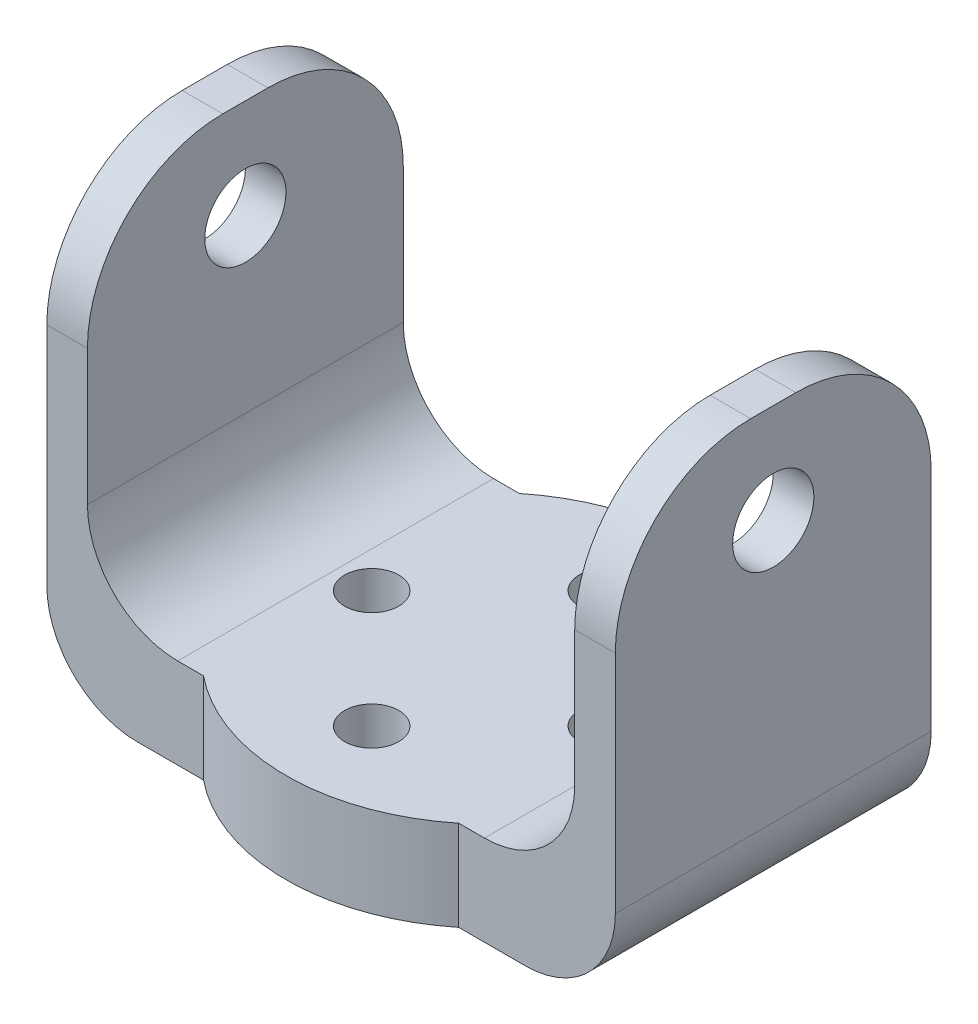
ISO-10303-21;
HEADER;
FILE_DESCRIPTION(('STEP AP214'),'2;1');
FILE_NAME('part.step','',(''),(''),'','','');
FILE_SCHEMA(('AUTOMOTIVE_DESIGN { 1 0 10303 214 1 1 1 1 }'));
ENDSEC;
DATA;
#1=APPLICATION_CONTEXT('core data for automotive mechanical design processes');
#2=APPLICATION_PROTOCOL_DEFINITION('international standard','automotive_design',2000,#1);
#3=PRODUCT_CONTEXT('',#1,'mechanical');
#4=PRODUCT('Part','Part','',(#3));
#5=PRODUCT_RELATED_PRODUCT_CATEGORY('part','',(#4));
#6=PRODUCT_DEFINITION_FORMATION('','',#4);
#7=PRODUCT_DEFINITION_CONTEXT('part definition',#1,'design');
#8=PRODUCT_DEFINITION('design','',#6,#7);
#9=PRODUCT_DEFINITION_SHAPE('','',#8);
#10=(LENGTH_UNIT() NAMED_UNIT(*) SI_UNIT(.MILLI.,.METRE.));
#11=(NAMED_UNIT(*) PLANE_ANGLE_UNIT() SI_UNIT($,.RADIAN.));
#12=(NAMED_UNIT(*) SI_UNIT($,.STERADIAN.) SOLID_ANGLE_UNIT());
#13=UNCERTAINTY_MEASURE_WITH_UNIT(LENGTH_MEASURE(1.E-05),#10,'distance_accuracy_value','');
#14=(GEOMETRIC_REPRESENTATION_CONTEXT(3) GLOBAL_UNCERTAINTY_ASSIGNED_CONTEXT((#13)) GLOBAL_UNIT_ASSIGNED_CONTEXT((#10,
#11,#12)) REPRESENTATION_CONTEXT('',''));
#15=CARTESIAN_POINT('',(0.,0.,0.));
#16=DIRECTION('',(0.,0.,1.));
#17=DIRECTION('',(1.,0.,0.));
#18=AXIS2_PLACEMENT_3D('',#15,#16,#17);
#19=CARTESIAN_POINT('',(0.,0.,-17.5));
#20=DIRECTION('',(0.,0.,1.));
#21=DIRECTION('',(1.,0.,0.));
#22=AXIS2_PLACEMENT_3D('',#19,#20,#21);
#23=PLANE('',#22);
#24=DIRECTION('',(0.,-1.,0.));
#25=VECTOR('',#24,1.);
#26=CARTESIAN_POINT('',(-31.5,50.,-17.5));
#27=LINE('',#26,#25);
#28=CARTESIAN_POINT('',(-31.5,35.,-17.5));
#29=VERTEX_POINT('',#28);
#30=CARTESIAN_POINT('',(-31.5,10.,-17.5));
#31=VERTEX_POINT('',#30);
#32=EDGE_CURVE('E239',#29,#31,#27,.T.);
#33=ORIENTED_EDGE('',*,*,#32,.F.);
#34=DIRECTION('',(-1.,0.,0.));
#35=VECTOR('',#34,1.);
#36=CARTESIAN_POINT('',(-27.,35.,-17.5));
#37=LINE('',#36,#35);
#38=CARTESIAN_POINT('',(-27.,35.,-17.5));
#39=VERTEX_POINT('',#38);
#40=EDGE_CURVE('E60',#29,#39,#37,.F.);
#41=ORIENTED_EDGE('',*,*,#40,.T.);
#42=DIRECTION('',(0.,1.,0.));
#43=VECTOR('',#42,1.);
#44=CARTESIAN_POINT('',(-27.,10.,-17.5));
#45=LINE('',#44,#43);
#46=CARTESIAN_POINT('',(-27.,20.,-17.5));
#47=VERTEX_POINT('',#46);
#48=EDGE_CURVE('E218',#47,#39,#45,.T.);
#49=ORIENTED_EDGE('',*,*,#48,.F.);
#50=CARTESIAN_POINT('',(-17.,20.,-17.5));
#51=DIRECTION('',(0.,0.,1.));
#52=DIRECTION('',(1.,0.,0.));
#53=AXIS2_PLACEMENT_3D('',#50,#51,#52);
#54=CIRCLE('',#53,10.);
#55=CARTESIAN_POINT('',(-17.,10.,-17.5));
#56=VERTEX_POINT('',#55);
#57=EDGE_CURVE('E214',#47,#56,#54,.T.);
#58=ORIENTED_EDGE('',*,*,#57,.T.);
#59=DIRECTION('',(-1.,0.,0.));
#60=VECTOR('',#59,1.);
#61=CARTESIAN_POINT('',(27.,10.,-17.5));
#62=LINE('',#61,#60);
#63=CARTESIAN_POINT('',(-14.142135623731,10.,-17.5));
#64=VERTEX_POINT('',#63);
#65=EDGE_CURVE('E206',#64,#56,#62,.T.);
#66=ORIENTED_EDGE('',*,*,#65,.F.);
#67=DIRECTION('',(0.,-1.,0.));
#68=VECTOR('',#67,1.);
#69=CARTESIAN_POINT('',(-14.142135623731,10.,-17.5));
#70=LINE('',#69,#68);
#71=CARTESIAN_POINT('',(-14.142135623731,0.,-17.5));
#72=VERTEX_POINT('',#71);
#73=EDGE_CURVE('E189',#64,#72,#70,.T.);
#74=ORIENTED_EDGE('',*,*,#73,.T.);
#75=DIRECTION('',(1.,0.,0.));
#76=VECTOR('',#75,1.);
#77=CARTESIAN_POINT('',(-31.5,0.,-17.5));
#78=LINE('',#77,#76);
#79=CARTESIAN_POINT('',(-21.5,0.,-17.5));
#80=VERTEX_POINT('',#79);
#81=EDGE_CURVE('E334',#80,#72,#78,.T.);
#82=ORIENTED_EDGE('',*,*,#81,.F.);
#83=CARTESIAN_POINT('',(-21.5,10.,-17.5));
#84=DIRECTION('',(0.,0.,1.));
#85=DIRECTION('',(1.,0.,0.));
#86=AXIS2_PLACEMENT_3D('',#83,#84,#85);
#87=CIRCLE('',#86,10.);
#88=EDGE_CURVE('E271',#80,#31,#87,.F.);
#89=ORIENTED_EDGE('',*,*,#88,.T.);
#90=EDGE_LOOP('',(#33,#41,#49,#58,#66,#74,#82,#89));
#91=FACE_BOUND('',#90,.T.);
#92=ADVANCED_FACE('F37',(#91),#23,.F.);
#93=CARTESIAN_POINT('',(0.,0.,17.5));
#94=DIRECTION('',(0.,0.,1.));
#95=DIRECTION('',(1.,0.,0.));
#96=AXIS2_PLACEMENT_3D('',#93,#94,#95);
#97=PLANE('',#96);
#98=DIRECTION('',(0.,1.,0.));
#99=VECTOR('',#98,1.);
#100=CARTESIAN_POINT('',(-27.,10.,17.5));
#101=LINE('',#100,#99);
#102=CARTESIAN_POINT('',(-27.,20.,17.5));
#103=VERTEX_POINT('',#102);
#104=CARTESIAN_POINT('',(-27.,35.,17.5));
#105=VERTEX_POINT('',#104);
#106=EDGE_CURVE('E237',#103,#105,#101,.T.);
#107=ORIENTED_EDGE('',*,*,#106,.T.);
#108=DIRECTION('',(-1.,0.,0.));
#109=VECTOR('',#108,1.);
#110=CARTESIAN_POINT('',(0.,35.,17.5));
#111=LINE('',#110,#109);
#112=CARTESIAN_POINT('',(-31.5,35.,17.5));
#113=VERTEX_POINT('',#112);
#114=EDGE_CURVE('E11',#105,#113,#111,.T.);
#115=ORIENTED_EDGE('',*,*,#114,.T.);
#116=DIRECTION('',(0.,-1.,0.));
#117=VECTOR('',#116,1.);
#118=CARTESIAN_POINT('',(-31.5,50.,17.5));
#119=LINE('',#118,#117);
#120=CARTESIAN_POINT('',(-31.5,10.,17.5));
#121=VERTEX_POINT('',#120);
#122=EDGE_CURVE('E199',#113,#121,#119,.T.);
#123=ORIENTED_EDGE('',*,*,#122,.T.);
#124=CARTESIAN_POINT('',(-21.5,10.,17.5));
#125=DIRECTION('',(0.,0.,1.));
#126=DIRECTION('',(1.,0.,0.));
#127=AXIS2_PLACEMENT_3D('',#124,#125,#126);
#128=CIRCLE('',#127,10.);
#129=CARTESIAN_POINT('',(-21.5,0.,17.5));
#130=VERTEX_POINT('',#129);
#131=EDGE_CURVE('E265',#121,#130,#128,.T.);
#132=ORIENTED_EDGE('',*,*,#131,.T.);
#133=DIRECTION('',(1.,0.,0.));
#134=VECTOR('',#133,1.);
#135=CARTESIAN_POINT('',(-31.5,0.,17.5));
#136=LINE('',#135,#134);
#137=CARTESIAN_POINT('',(-14.142135623731,0.,17.5));
#138=VERTEX_POINT('',#137);
#139=EDGE_CURVE('E227',#130,#138,#136,.T.);
#140=ORIENTED_EDGE('',*,*,#139,.T.);
#141=DIRECTION('',(0.,-1.,0.));
#142=VECTOR('',#141,1.);
#143=CARTESIAN_POINT('',(-14.142135623731,10.,17.5));
#144=LINE('',#143,#142);
#145=CARTESIAN_POINT('',(-14.142135623731,10.,17.5));
#146=VERTEX_POINT('',#145);
#147=EDGE_CURVE('E379',#146,#138,#144,.T.);
#148=ORIENTED_EDGE('',*,*,#147,.F.);
#149=DIRECTION('',(-1.,0.,0.));
#150=VECTOR('',#149,1.);
#151=CARTESIAN_POINT('',(27.,10.,17.5));
#152=LINE('',#151,#150);
#153=CARTESIAN_POINT('',(-17.,10.,17.5));
#154=VERTEX_POINT('',#153);
#155=EDGE_CURVE('E234',#146,#154,#152,.T.);
#156=ORIENTED_EDGE('',*,*,#155,.T.);
#157=CARTESIAN_POINT('',(-17.,20.,17.5));
#158=DIRECTION('',(0.,0.,1.));
#159=DIRECTION('',(1.,0.,0.));
#160=AXIS2_PLACEMENT_3D('',#157,#158,#159);
#161=CIRCLE('',#160,10.);
#162=EDGE_CURVE('E287',#154,#103,#161,.F.);
#163=ORIENTED_EDGE('',*,*,#162,.T.);
#164=EDGE_LOOP('',(#107,#115,#123,#132,#140,#148,#156,#163));
#165=FACE_BOUND('',#164,.T.);
#166=ADVANCED_FACE('F419',(#165),#97,.T.);
#167=CARTESIAN_POINT('',(-31.5,50.,-17.5));
#168=DIRECTION('',(-1.,0.,0.));
#169=DIRECTION('',(0.,0.,1.));
#170=AXIS2_PLACEMENT_3D('',#167,#168,#169);
#171=PLANE('',#170);
#172=CARTESIAN_POINT('',(-31.5,39.,0.));
#173=DIRECTION('',(1.,0.,0.));
#174=DIRECTION('',(0.,1.,0.));
#175=AXIS2_PLACEMENT_3D('',#172,#173,#174);
#176=CIRCLE('',#175,4.5);
#177=CARTESIAN_POINT('',(-31.5,43.5,0.));
#178=VERTEX_POINT('',#177);
#179=EDGE_CURVE('E514',#178,#178,#176,.T.);
#180=ORIENTED_EDGE('',*,*,#179,.T.);
#181=EDGE_LOOP('',(#180));
#182=FACE_BOUND('',#181,.T.);
#183=DIRECTION('',(0.,0.,1.));
#184=VECTOR('',#183,1.);
#185=CARTESIAN_POINT('',(-31.5,50.,-17.5));
#186=LINE('',#185,#184);
#187=CARTESIAN_POINT('',(-31.5,50.,-2.5));
#188=VERTEX_POINT('',#187);
#189=CARTESIAN_POINT('',(-31.5,50.,2.5));
#190=VERTEX_POINT('',#189);
#191=EDGE_CURVE('E240',#188,#190,#186,.T.);
#192=ORIENTED_EDGE('',*,*,#191,.F.);
#193=CARTESIAN_POINT('',(-31.5,35.,-2.5));
#194=DIRECTION('',(-1.,0.,0.));
#195=DIRECTION('',(0.,0.,1.));
#196=AXIS2_PLACEMENT_3D('',#193,#194,#195);
#197=CIRCLE('',#196,15.);
#198=EDGE_CURVE('E315',#188,#29,#197,.T.);
#199=ORIENTED_EDGE('',*,*,#198,.T.);
#200=ORIENTED_EDGE('',*,*,#32,.T.);
#201=DIRECTION('',(0.,0.,1.));
#202=VECTOR('',#201,1.);
#203=CARTESIAN_POINT('',(-31.5,10.,-17.5));
#204=LINE('',#203,#202);
#205=EDGE_CURVE('E277',#31,#121,#204,.T.);
#206=ORIENTED_EDGE('',*,*,#205,.T.);
#207=ORIENTED_EDGE('',*,*,#122,.F.);
#208=CARTESIAN_POINT('',(-31.5,35.,2.5));
#209=DIRECTION('',(-1.,0.,0.));
#210=DIRECTION('',(0.,0.,1.));
#211=AXIS2_PLACEMENT_3D('',#208,#209,#210);
#212=CIRCLE('',#211,15.);
#213=EDGE_CURVE('E313',#113,#190,#212,.T.);
#214=ORIENTED_EDGE('',*,*,#213,.T.);
#215=EDGE_LOOP('',(#192,#199,#200,#206,#207,#214));
#216=FACE_BOUND('',#215,.T.);
#217=ADVANCED_FACE('F329',(#182,#216),#171,.T.);
#218=CARTESIAN_POINT('',(-27.,50.,-17.5));
#219=DIRECTION('',(0.,1.,0.));
#220=DIRECTION('',(0.,0.,1.));
#221=AXIS2_PLACEMENT_3D('',#218,#219,#220);
#222=PLANE('',#221);
#223=DIRECTION('',(0.,0.,1.));
#224=VECTOR('',#223,1.);
#225=CARTESIAN_POINT('',(-27.,50.,-17.5));
#226=LINE('',#225,#224);
#227=CARTESIAN_POINT('',(-27.,50.,-2.5));
#228=VERTEX_POINT('',#227);
#229=CARTESIAN_POINT('',(-27.,50.,2.5));
#230=VERTEX_POINT('',#229);
#231=EDGE_CURVE('E244',#228,#230,#226,.T.);
#232=ORIENTED_EDGE('',*,*,#231,.F.);
#233=DIRECTION('',(-1.,0.,0.));
#234=VECTOR('',#233,1.);
#235=CARTESIAN_POINT('',(-31.5,50.,-2.5));
#236=LINE('',#235,#234);
#237=EDGE_CURVE('E310',#228,#188,#236,.T.);
#238=ORIENTED_EDGE('',*,*,#237,.T.);
#239=ORIENTED_EDGE('',*,*,#191,.T.);
#240=DIRECTION('',(-1.,0.,0.));
#241=VECTOR('',#240,1.);
#242=CARTESIAN_POINT('',(-27.,50.,2.5));
#243=LINE('',#242,#241);
#244=EDGE_CURVE('E308',#190,#230,#243,.F.);
#245=ORIENTED_EDGE('',*,*,#244,.T.);
#246=EDGE_LOOP('',(#232,#238,#239,#245));
#247=FACE_BOUND('',#246,.T.);
#248=ADVANCED_FACE('F324',(#247),#222,.T.);
#249=CARTESIAN_POINT('',(-27.,10.,-17.5));
#250=DIRECTION('',(1.,0.,0.));
#251=DIRECTION('',(0.,1.,0.));
#252=AXIS2_PLACEMENT_3D('',#249,#250,#251);
#253=PLANE('',#252);
#254=CARTESIAN_POINT('',(-27.,39.,0.));
#255=DIRECTION('',(1.,0.,0.));
#256=DIRECTION('',(0.,1.,0.));
#257=AXIS2_PLACEMENT_3D('',#254,#255,#256);
#258=CIRCLE('',#257,4.5);
#259=CARTESIAN_POINT('',(-27.,43.5,0.));
#260=VERTEX_POINT('',#259);
#261=EDGE_CURVE('E489',#260,#260,#258,.T.);
#262=ORIENTED_EDGE('',*,*,#261,.F.);
#263=EDGE_LOOP('',(#262));
#264=FACE_BOUND('',#263,.T.);
#265=ORIENTED_EDGE('',*,*,#48,.T.);
#266=CARTESIAN_POINT('',(-27.,35.,-2.5));
#267=DIRECTION('',(1.,0.,0.));
#268=DIRECTION('',(0.,1.,0.));
#269=AXIS2_PLACEMENT_3D('',#266,#267,#268);
#270=CIRCLE('',#269,15.);
#271=EDGE_CURVE('E45',#39,#228,#270,.T.);
#272=ORIENTED_EDGE('',*,*,#271,.T.);
#273=ORIENTED_EDGE('',*,*,#231,.T.);
#274=CARTESIAN_POINT('',(-27.,35.,2.5));
#275=DIRECTION('',(1.,0.,0.));
#276=DIRECTION('',(0.,1.,0.));
#277=AXIS2_PLACEMENT_3D('',#274,#275,#276);
#278=CIRCLE('',#277,15.);
#279=EDGE_CURVE('E52',#230,#105,#278,.T.);
#280=ORIENTED_EDGE('',*,*,#279,.T.);
#281=ORIENTED_EDGE('',*,*,#106,.F.);
#282=DIRECTION('',(0.,0.,1.));
#283=VECTOR('',#282,1.);
#284=CARTESIAN_POINT('',(-27.,20.,-17.5));
#285=LINE('',#284,#283);
#286=EDGE_CURVE('E280',#103,#47,#285,.F.);
#287=ORIENTED_EDGE('',*,*,#286,.T.);
#288=EDGE_LOOP('',(#265,#272,#273,#280,#281,#287));
#289=FACE_BOUND('',#288,.T.);
#290=ADVANCED_FACE('F320',(#264,#289),#253,.T.);
#291=CARTESIAN_POINT('',(27.,10.,-17.5));
#292=DIRECTION('',(0.,1.,0.));
#293=DIRECTION('',(0.,0.,1.));
#294=AXIS2_PLACEMENT_3D('',#291,#292,#293);
#295=PLANE('',#294);
#296=CARTESIAN_POINT('',(0.,10.,13.));
#297=DIRECTION('',(0.,-1.,0.));
#298=DIRECTION('',(1.,0.,0.));
#299=AXIS2_PLACEMENT_3D('',#296,#297,#298);
#300=CIRCLE('',#299,3.);
#301=CARTESIAN_POINT('',(3.,10.,13.));
#302=VERTEX_POINT('',#301);
#303=EDGE_CURVE('E479',#302,#302,#300,.T.);
#304=ORIENTED_EDGE('',*,*,#303,.T.);
#305=EDGE_LOOP('',(#304));
#306=FACE_BOUND('',#305,.T.);
#307=CARTESIAN_POINT('',(13.,10.,0.));
#308=DIRECTION('',(0.,-1.,0.));
#309=DIRECTION('',(1.,0.,0.));
#310=AXIS2_PLACEMENT_3D('',#307,#308,#309);
#311=CIRCLE('',#310,3.00000000000007);
#312=CARTESIAN_POINT('',(16.0000000000001,10.,0.));
#313=VERTEX_POINT('',#312);
#314=EDGE_CURVE('E494',#313,#313,#311,.T.);
#315=ORIENTED_EDGE('',*,*,#314,.T.);
#316=EDGE_LOOP('',(#315));
#317=FACE_BOUND('',#316,.T.);
#318=CARTESIAN_POINT('',(0.,10.,-13.));
#319=DIRECTION('',(0.,-1.,0.));
#320=DIRECTION('',(1.,0.,0.));
#321=AXIS2_PLACEMENT_3D('',#318,#319,#320);
#322=CIRCLE('',#321,3.);
#323=CARTESIAN_POINT('',(3.,10.,-13.));
#324=VERTEX_POINT('',#323);
#325=EDGE_CURVE('E500',#324,#324,#322,.T.);
#326=ORIENTED_EDGE('',*,*,#325,.T.);
#327=EDGE_LOOP('',(#326));
#328=FACE_BOUND('',#327,.T.);
#329=CARTESIAN_POINT('',(-13.,10.,0.));
#330=DIRECTION('',(0.,-1.,0.));
#331=DIRECTION('',(1.,0.,0.));
#332=AXIS2_PLACEMENT_3D('',#329,#330,#331);
#333=CIRCLE('',#332,2.99999999999999);
#334=CARTESIAN_POINT('',(-10.,10.,0.));
#335=VERTEX_POINT('',#334);
#336=EDGE_CURVE('E477',#335,#335,#333,.T.);
#337=ORIENTED_EDGE('',*,*,#336,.T.);
#338=EDGE_LOOP('',(#337));
#339=FACE_BOUND('',#338,.T.);
#340=ORIENTED_EDGE('',*,*,#155,.F.);
#341=CARTESIAN_POINT('',(0.,10.,0.));
#342=DIRECTION('',(0.,-1.,0.));
#343=DIRECTION('',(1.,0.,0.));
#344=AXIS2_PLACEMENT_3D('',#341,#342,#343);
#345=CIRCLE('',#344,22.5);
#346=CARTESIAN_POINT('',(14.142135623731,10.,17.5));
#347=VERTEX_POINT('',#346);
#348=EDGE_CURVE('E210',#347,#146,#345,.T.);
#349=ORIENTED_EDGE('',*,*,#348,.F.);
#350=CARTESIAN_POINT('',(17.,10.,17.5));
#351=VERTEX_POINT('',#350);
#352=EDGE_CURVE('E235',#351,#347,#152,.T.);
#353=ORIENTED_EDGE('',*,*,#352,.F.);
#354=DIRECTION('',(0.,0.,1.));
#355=VECTOR('',#354,1.);
#356=CARTESIAN_POINT('',(17.,10.,-17.5));
#357=LINE('',#356,#355);
#358=CARTESIAN_POINT('',(17.,10.,-17.5));
#359=VERTEX_POINT('',#358);
#360=EDGE_CURVE('E255',#351,#359,#357,.F.);
#361=ORIENTED_EDGE('',*,*,#360,.T.);
#362=CARTESIAN_POINT('',(14.142135623731,10.,-17.5));
#363=VERTEX_POINT('',#362);
#364=EDGE_CURVE('E209',#359,#363,#62,.T.);
#365=ORIENTED_EDGE('',*,*,#364,.T.);
#366=EDGE_CURVE('E193',#64,#363,#345,.T.);
#367=ORIENTED_EDGE('',*,*,#366,.F.);
#368=ORIENTED_EDGE('',*,*,#65,.T.);
#369=DIRECTION('',(0.,0.,1.));
#370=VECTOR('',#369,1.);
#371=CARTESIAN_POINT('',(-17.,10.,17.5));
#372=LINE('',#371,#370);
#373=EDGE_CURVE('E253',#56,#154,#372,.T.);
#374=ORIENTED_EDGE('',*,*,#373,.T.);
#375=EDGE_LOOP('',(#340,#349,#353,#361,#365,#367,#368,#374));
#376=FACE_BOUND('',#375,.T.);
#377=ADVANCED_FACE('F205',(#306,#317,#328,#339,#376),#295,.T.);
#378=CARTESIAN_POINT('',(27.,50.,-17.5));
#379=DIRECTION('',(-1.,0.,0.));
#380=DIRECTION('',(0.,-1.,0.));
#381=AXIS2_PLACEMENT_3D('',#378,#379,#380);
#382=PLANE('',#381);
#383=CARTESIAN_POINT('',(27.,39.,0.));
#384=DIRECTION('',(-1.,0.,0.));
#385=DIRECTION('',(0.,-1.,0.));
#386=AXIS2_PLACEMENT_3D('',#383,#384,#385);
#387=CIRCLE('',#386,4.5);
#388=CARTESIAN_POINT('',(27.,34.5,0.));
#389=VERTEX_POINT('',#388);
#390=EDGE_CURVE('E510',#389,#389,#387,.T.);
#391=ORIENTED_EDGE('',*,*,#390,.F.);
#392=EDGE_LOOP('',(#391));
#393=FACE_BOUND('',#392,.T.);
#394=DIRECTION('',(0.,-1.,0.));
#395=VECTOR('',#394,1.);
#396=CARTESIAN_POINT('',(27.,50.,17.5));
#397=LINE('',#396,#395);
#398=CARTESIAN_POINT('',(27.,35.,17.5));
#399=VERTEX_POINT('',#398);
#400=CARTESIAN_POINT('',(27.,20.,17.5));
#401=VERTEX_POINT('',#400);
#402=EDGE_CURVE('E232',#399,#401,#397,.T.);
#403=ORIENTED_EDGE('',*,*,#402,.F.);
#404=CARTESIAN_POINT('',(27.,35.,2.5));
#405=DIRECTION('',(-1.,0.,0.));
#406=DIRECTION('',(0.,-1.,0.));
#407=AXIS2_PLACEMENT_3D('',#404,#405,#406);
#408=CIRCLE('',#407,15.);
#409=CARTESIAN_POINT('',(27.,50.,2.5));
#410=VERTEX_POINT('',#409);
#411=EDGE_CURVE('E295',#399,#410,#408,.T.);
#412=ORIENTED_EDGE('',*,*,#411,.T.);
#413=DIRECTION('',(0.,0.,1.));
#414=VECTOR('',#413,1.);
#415=CARTESIAN_POINT('',(27.,50.,-17.5));
#416=LINE('',#415,#414);
#417=CARTESIAN_POINT('',(27.,50.,-2.5));
#418=VERTEX_POINT('',#417);
#419=EDGE_CURVE('E246',#418,#410,#416,.T.);
#420=ORIENTED_EDGE('',*,*,#419,.F.);
#421=CARTESIAN_POINT('',(27.,35.,-2.5));
#422=DIRECTION('',(-1.,0.,0.));
#423=DIRECTION('',(0.,-1.,0.));
#424=AXIS2_PLACEMENT_3D('',#421,#422,#423);
#425=CIRCLE('',#424,15.);
#426=CARTESIAN_POINT('',(27.,35.,-17.5));
#427=VERTEX_POINT('',#426);
#428=EDGE_CURVE('E293',#418,#427,#425,.T.);
#429=ORIENTED_EDGE('',*,*,#428,.T.);
#430=DIRECTION('',(0.,-1.,0.));
#431=VECTOR('',#430,1.);
#432=CARTESIAN_POINT('',(27.,50.,-17.5));
#433=LINE('',#432,#431);
#434=CARTESIAN_POINT('',(27.,20.,-17.5));
#435=VERTEX_POINT('',#434);
#436=EDGE_CURVE('E216',#427,#435,#433,.T.);
#437=ORIENTED_EDGE('',*,*,#436,.T.);
#438=DIRECTION('',(0.,0.,1.));
#439=VECTOR('',#438,1.);
#440=CARTESIAN_POINT('',(27.,20.,17.5));
#441=LINE('',#440,#439);
#442=EDGE_CURVE('E243',#435,#401,#441,.T.);
#443=ORIENTED_EDGE('',*,*,#442,.T.);
#444=EDGE_LOOP('',(#403,#412,#420,#429,#437,#443));
#445=FACE_BOUND('',#444,.T.);
#446=ADVANCED_FACE('F357',(#393,#445),#382,.T.);
#447=CARTESIAN_POINT('',(31.5,50.,-17.5));
#448=DIRECTION('',(0.,1.,0.));
#449=DIRECTION('',(0.,0.,1.));
#450=AXIS2_PLACEMENT_3D('',#447,#448,#449);
#451=PLANE('',#450);
#452=ORIENTED_EDGE('',*,*,#419,.T.);
#453=DIRECTION('',(-1.,0.,0.));
#454=VECTOR('',#453,1.);
#455=CARTESIAN_POINT('',(31.5,50.,2.5));
#456=LINE('',#455,#454);
#457=CARTESIAN_POINT('',(31.5,50.,2.5));
#458=VERTEX_POINT('',#457);
#459=EDGE_CURVE('E300',#410,#458,#456,.F.);
#460=ORIENTED_EDGE('',*,*,#459,.T.);
#461=DIRECTION('',(0.,0.,1.));
#462=VECTOR('',#461,1.);
#463=CARTESIAN_POINT('',(31.5,50.,-17.5));
#464=LINE('',#463,#462);
#465=CARTESIAN_POINT('',(31.5,50.,-2.5));
#466=VERTEX_POINT('',#465);
#467=EDGE_CURVE('E224',#466,#458,#464,.T.);
#468=ORIENTED_EDGE('',*,*,#467,.F.);
#469=DIRECTION('',(-1.,0.,0.));
#470=VECTOR('',#469,1.);
#471=CARTESIAN_POINT('',(27.,50.,-2.5));
#472=LINE('',#471,#470);
#473=EDGE_CURVE('E297',#466,#418,#472,.T.);
#474=ORIENTED_EDGE('',*,*,#473,.T.);
#475=EDGE_LOOP('',(#452,#460,#468,#474));
#476=FACE_BOUND('',#475,.T.);
#477=ADVANCED_FACE('F353',(#476),#451,.T.);
#478=CARTESIAN_POINT('',(31.5,0.,-17.5));
#479=DIRECTION('',(1.,0.,0.));
#480=DIRECTION('',(0.,0.,-1.));
#481=AXIS2_PLACEMENT_3D('',#478,#479,#480);
#482=PLANE('',#481);
#483=CARTESIAN_POINT('',(31.5,39.,0.));
#484=DIRECTION('',(1.,0.,0.));
#485=DIRECTION('',(0.,1.,0.));
#486=AXIS2_PLACEMENT_3D('',#483,#484,#485);
#487=CIRCLE('',#486,4.5);
#488=CARTESIAN_POINT('',(31.5,43.5,0.));
#489=VERTEX_POINT('',#488);
#490=EDGE_CURVE('E518',#489,#489,#487,.T.);
#491=ORIENTED_EDGE('',*,*,#490,.F.);
#492=EDGE_LOOP('',(#491));
#493=FACE_BOUND('',#492,.T.);
#494=ORIENTED_EDGE('',*,*,#467,.T.);
#495=CARTESIAN_POINT('',(31.5,35.,2.5));
#496=DIRECTION('',(1.,0.,0.));
#497=DIRECTION('',(0.,0.,-1.));
#498=AXIS2_PLACEMENT_3D('',#495,#496,#497);
#499=CIRCLE('',#498,15.);
#500=CARTESIAN_POINT('',(31.5,35.,17.5));
#501=VERTEX_POINT('',#500);
#502=EDGE_CURVE('E304',#458,#501,#499,.T.);
#503=ORIENTED_EDGE('',*,*,#502,.T.);
#504=DIRECTION('',(0.,1.,0.));
#505=VECTOR('',#504,1.);
#506=CARTESIAN_POINT('',(31.5,0.,17.5));
#507=LINE('',#506,#505);
#508=CARTESIAN_POINT('',(31.5,10.,17.5));
#509=VERTEX_POINT('',#508);
#510=EDGE_CURVE('E229',#509,#501,#507,.T.);
#511=ORIENTED_EDGE('',*,*,#510,.F.);
#512=DIRECTION('',(0.,0.,1.));
#513=VECTOR('',#512,1.);
#514=CARTESIAN_POINT('',(31.5,10.,-17.5));
#515=LINE('',#514,#513);
#516=CARTESIAN_POINT('',(31.5,10.,-17.5));
#517=VERTEX_POINT('',#516);
#518=EDGE_CURVE('E269',#509,#517,#515,.F.);
#519=ORIENTED_EDGE('',*,*,#518,.T.);
#520=DIRECTION('',(0.,1.,0.));
#521=VECTOR('',#520,1.);
#522=CARTESIAN_POINT('',(31.5,0.,-17.5));
#523=LINE('',#522,#521);
#524=CARTESIAN_POINT('',(31.5,35.,-17.5));
#525=VERTEX_POINT('',#524);
#526=EDGE_CURVE('E219',#517,#525,#523,.T.);
#527=ORIENTED_EDGE('',*,*,#526,.T.);
#528=CARTESIAN_POINT('',(31.5,35.,-2.5));
#529=DIRECTION('',(1.,0.,0.));
#530=DIRECTION('',(0.,0.,-1.));
#531=AXIS2_PLACEMENT_3D('',#528,#529,#530);
#532=CIRCLE('',#531,15.);
#533=EDGE_CURVE('E302',#525,#466,#532,.T.);
#534=ORIENTED_EDGE('',*,*,#533,.T.);
#535=EDGE_LOOP('',(#494,#503,#511,#519,#527,#534));
#536=FACE_BOUND('',#535,.T.);
#537=ADVANCED_FACE('F341',(#493,#536),#482,.T.);
#538=CARTESIAN_POINT('',(-31.5,0.,-17.5));
#539=DIRECTION('',(0.,-1.,0.));
#540=DIRECTION('',(1.,0.,0.));
#541=AXIS2_PLACEMENT_3D('',#538,#539,#540);
#542=PLANE('',#541);
#543=CARTESIAN_POINT('',(0.,0.,13.));
#544=DIRECTION('',(0.,-1.,0.));
#545=DIRECTION('',(1.,0.,0.));
#546=AXIS2_PLACEMENT_3D('',#543,#544,#545);
#547=CIRCLE('',#546,3.);
#548=CARTESIAN_POINT('',(3.,0.,13.));
#549=VERTEX_POINT('',#548);
#550=EDGE_CURVE('E482',#549,#549,#547,.T.);
#551=ORIENTED_EDGE('',*,*,#550,.F.);
#552=EDGE_LOOP('',(#551));
#553=FACE_BOUND('',#552,.T.);
#554=CARTESIAN_POINT('',(13.,0.,0.));
#555=DIRECTION('',(0.,-1.,0.));
#556=DIRECTION('',(1.,0.,0.));
#557=AXIS2_PLACEMENT_3D('',#554,#555,#556);
#558=CIRCLE('',#557,3.00000000000007);
#559=CARTESIAN_POINT('',(16.0000000000001,0.,0.));
#560=VERTEX_POINT('',#559);
#561=EDGE_CURVE('E486',#560,#560,#558,.T.);
#562=ORIENTED_EDGE('',*,*,#561,.F.);
#563=EDGE_LOOP('',(#562));
#564=FACE_BOUND('',#563,.T.);
#565=CARTESIAN_POINT('',(0.,0.,-13.));
#566=DIRECTION('',(0.,-1.,0.));
#567=DIRECTION('',(1.,0.,0.));
#568=AXIS2_PLACEMENT_3D('',#565,#566,#567);
#569=CIRCLE('',#568,3.);
#570=CARTESIAN_POINT('',(3.,0.,-13.));
#571=VERTEX_POINT('',#570);
#572=EDGE_CURVE('E497',#571,#571,#569,.T.);
#573=ORIENTED_EDGE('',*,*,#572,.F.);
#574=EDGE_LOOP('',(#573));
#575=FACE_BOUND('',#574,.T.);
#576=CARTESIAN_POINT('',(-13.,0.,0.));
#577=DIRECTION('',(0.,-1.,0.));
#578=DIRECTION('',(1.,0.,0.));
#579=AXIS2_PLACEMENT_3D('',#576,#577,#578);
#580=CIRCLE('',#579,2.99999999999999);
#581=CARTESIAN_POINT('',(-10.,0.,0.));
#582=VERTEX_POINT('',#581);
#583=EDGE_CURVE('E502',#582,#582,#580,.T.);
#584=ORIENTED_EDGE('',*,*,#583,.F.);
#585=EDGE_LOOP('',(#584));
#586=FACE_BOUND('',#585,.T.);
#587=DIRECTION('',(0.,0.,1.));
#588=VECTOR('',#587,1.);
#589=CARTESIAN_POINT('',(21.5,0.,-17.5));
#590=LINE('',#589,#588);
#591=CARTESIAN_POINT('',(21.5,0.,-17.5));
#592=VERTEX_POINT('',#591);
#593=CARTESIAN_POINT('',(21.5,0.,-6.63324958071082));
#594=VERTEX_POINT('',#593);
#595=EDGE_CURVE('E262',#592,#594,#590,.T.);
#596=ORIENTED_EDGE('',*,*,#595,.T.);
#597=CARTESIAN_POINT('',(0.,0.,0.));
#598=DIRECTION('',(0.,-1.,0.));
#599=DIRECTION('',(1.,0.,0.));
#600=AXIS2_PLACEMENT_3D('',#597,#598,#599);
#601=CIRCLE('',#600,22.5);
#602=CARTESIAN_POINT('',(21.5,0.,6.63324958071082));
#603=VERTEX_POINT('',#602);
#604=EDGE_CURVE('E377',#594,#603,#601,.T.);
#605=ORIENTED_EDGE('',*,*,#604,.T.);
#606=CARTESIAN_POINT('',(21.5,0.,17.5));
#607=VERTEX_POINT('',#606);
#608=EDGE_CURVE('E261',#603,#607,#590,.T.);
#609=ORIENTED_EDGE('',*,*,#608,.T.);
#610=CARTESIAN_POINT('',(14.142135623731,0.,17.5));
#611=VERTEX_POINT('',#610);
#612=EDGE_CURVE('E226',#611,#607,#136,.T.);
#613=ORIENTED_EDGE('',*,*,#612,.F.);
#614=EDGE_CURVE('E211',#611,#138,#601,.T.);
#615=ORIENTED_EDGE('',*,*,#614,.T.);
#616=ORIENTED_EDGE('',*,*,#139,.F.);
#617=DIRECTION('',(0.,0.,1.));
#618=VECTOR('',#617,1.);
#619=CARTESIAN_POINT('',(-21.5,0.,-17.5));
#620=LINE('',#619,#618);
#621=CARTESIAN_POINT('',(-21.5,0.,6.63324958071084));
#622=VERTEX_POINT('',#621);
#623=EDGE_CURVE('E258',#130,#622,#620,.F.);
#624=ORIENTED_EDGE('',*,*,#623,.T.);
#625=CARTESIAN_POINT('',(-21.5,0.,-6.63324958071084));
#626=VERTEX_POINT('',#625);
#627=EDGE_CURVE('E376',#622,#626,#601,.T.);
#628=ORIENTED_EDGE('',*,*,#627,.T.);
#629=EDGE_CURVE('E257',#626,#80,#620,.F.);
#630=ORIENTED_EDGE('',*,*,#629,.T.);
#631=ORIENTED_EDGE('',*,*,#81,.T.);
#632=CARTESIAN_POINT('',(14.1421356237309,0.,-17.5));
#633=VERTEX_POINT('',#632);
#634=EDGE_CURVE('E195',#72,#633,#601,.T.);
#635=ORIENTED_EDGE('',*,*,#634,.T.);
#636=EDGE_CURVE('E332',#633,#592,#78,.T.);
#637=ORIENTED_EDGE('',*,*,#636,.T.);
#638=EDGE_LOOP('',(#596,#605,#609,#613,#615,#616,#624,#628,#630,#631,#635,#637));
#639=FACE_BOUND('',#638,.T.);
#640=ADVANCED_FACE('F375',(#553,#564,#575,#586,#639),#542,.T.);
#641=ORIENTED_EDGE('',*,*,#436,.F.);
#642=DIRECTION('',(-1.,0.,0.));
#643=VECTOR('',#642,1.);
#644=CARTESIAN_POINT('',(31.5,35.,-17.5));
#645=LINE('',#644,#643);
#646=EDGE_CURVE('E306',#427,#525,#645,.F.);
#647=ORIENTED_EDGE('',*,*,#646,.T.);
#648=ORIENTED_EDGE('',*,*,#526,.F.);
#649=CARTESIAN_POINT('',(21.5,10.,-17.5));
#650=DIRECTION('',(0.,0.,1.));
#651=DIRECTION('',(1.,0.,0.));
#652=AXIS2_PLACEMENT_3D('',#649,#650,#651);
#653=CIRCLE('',#652,10.);
#654=EDGE_CURVE('E274',#517,#592,#653,.F.);
#655=ORIENTED_EDGE('',*,*,#654,.T.);
#656=ORIENTED_EDGE('',*,*,#636,.F.);
#657=DIRECTION('',(0.,-1.,0.));
#658=VECTOR('',#657,1.);
#659=CARTESIAN_POINT('',(14.142135623731,10.,-17.5));
#660=LINE('',#659,#658);
#661=EDGE_CURVE('E200',#633,#363,#660,.F.);
#662=ORIENTED_EDGE('',*,*,#661,.T.);
#663=ORIENTED_EDGE('',*,*,#364,.F.);
#664=CARTESIAN_POINT('',(17.,20.,-17.5));
#665=DIRECTION('',(0.,0.,1.));
#666=DIRECTION('',(1.,0.,0.));
#667=AXIS2_PLACEMENT_3D('',#664,#665,#666);
#668=CIRCLE('',#667,10.);
#669=EDGE_CURVE('E284',#359,#435,#668,.T.);
#670=ORIENTED_EDGE('',*,*,#669,.T.);
#671=EDGE_LOOP('',(#641,#647,#648,#655,#656,#662,#663,#670));
#672=FACE_BOUND('',#671,.T.);
#673=ADVANCED_FACE('F373',(#672),#23,.F.);
#674=ORIENTED_EDGE('',*,*,#510,.T.);
#675=DIRECTION('',(-1.,0.,0.));
#676=VECTOR('',#675,1.);
#677=CARTESIAN_POINT('',(0.,35.,17.5));
#678=LINE('',#677,#676);
#679=EDGE_CURVE('E290',#501,#399,#678,.T.);
#680=ORIENTED_EDGE('',*,*,#679,.T.);
#681=ORIENTED_EDGE('',*,*,#402,.T.);
#682=CARTESIAN_POINT('',(17.,20.,17.5));
#683=DIRECTION('',(0.,0.,1.));
#684=DIRECTION('',(1.,0.,0.));
#685=AXIS2_PLACEMENT_3D('',#682,#683,#684);
#686=CIRCLE('',#685,10.);
#687=EDGE_CURVE('E282',#401,#351,#686,.F.);
#688=ORIENTED_EDGE('',*,*,#687,.T.);
#689=ORIENTED_EDGE('',*,*,#352,.T.);
#690=DIRECTION('',(0.,-1.,0.));
#691=VECTOR('',#690,1.);
#692=CARTESIAN_POINT('',(14.142135623731,10.,17.5));
#693=LINE('',#692,#691);
#694=EDGE_CURVE('E381',#611,#347,#693,.F.);
#695=ORIENTED_EDGE('',*,*,#694,.F.);
#696=ORIENTED_EDGE('',*,*,#612,.T.);
#697=CARTESIAN_POINT('',(21.5,10.,17.5));
#698=DIRECTION('',(0.,0.,1.));
#699=DIRECTION('',(1.,0.,0.));
#700=AXIS2_PLACEMENT_3D('',#697,#698,#699);
#701=CIRCLE('',#700,10.);
#702=EDGE_CURVE('E267',#607,#509,#701,.T.);
#703=ORIENTED_EDGE('',*,*,#702,.T.);
#704=EDGE_LOOP('',(#674,#680,#681,#688,#689,#695,#696,#703));
#705=FACE_BOUND('',#704,.T.);
#706=ADVANCED_FACE('F364',(#705),#97,.T.);
#707=CARTESIAN_POINT('',(17.,20.,-17.5));
#708=DIRECTION('',(0.,0.,-1.));
#709=DIRECTION('',(-1.,0.,0.));
#710=AXIS2_PLACEMENT_3D('',#707,#708,#709);
#711=CYLINDRICAL_SURFACE('',#710,10.);
#712=ORIENTED_EDGE('',*,*,#669,.F.);
#713=ORIENTED_EDGE('',*,*,#360,.F.);
#714=ORIENTED_EDGE('',*,*,#687,.F.);
#715=ORIENTED_EDGE('',*,*,#442,.F.);
#716=EDGE_LOOP('',(#712,#713,#714,#715));
#717=FACE_BOUND('',#716,.T.);
#718=ADVANCED_FACE('F418',(#717),#711,.F.);
#719=CARTESIAN_POINT('',(21.5,10.,-17.5));
#720=DIRECTION('',(0.,0.,1.));
#721=DIRECTION('',(1.,0.,0.));
#722=AXIS2_PLACEMENT_3D('',#719,#720,#721);
#723=CYLINDRICAL_SURFACE('',#722,10.);
#724=CARTESIAN_POINT('',(21.5,0.,-6.63324958071084));
#725=CARTESIAN_POINT('',(21.5942596667348,2.56451021517282E-05,-6.32774572977275));
#726=CARTESIAN_POINT('',(21.6819976183243,0.0013336462480139,-6.0202361546445));
#727=CARTESIAN_POINT('',(21.8442905012952,0.00559203244091773,-5.4017707849772));
#728=CARTESIAN_POINT('',(21.9188455416654,0.00854240390894306,-5.09081501895188));
#729=CARTESIAN_POINT('',(22.0546444840204,0.015163716606748,-4.46597183477331));
#730=CARTESIAN_POINT('',(22.1158864417941,0.0188347629334075,-4.15208399539855));
#731=CARTESIAN_POINT('',(22.2249374875833,0.0261610729124917,-3.5219848904032));
#732=CARTESIAN_POINT('',(22.2727466695339,0.0298163366751076,-3.20577364104603));
#733=CARTESIAN_POINT('',(22.3538366480208,0.036437705701356,-2.57939040992556));
#734=CARTESIAN_POINT('',(22.3874456759924,0.0394185424291722,-2.26926103728718));
#735=CARTESIAN_POINT('',(22.4417425505964,0.0444053579194365,-1.64786583646487));
#736=CARTESIAN_POINT('',(22.4624304206651,0.0464113384500751,-1.33660001034327));
#737=CARTESIAN_POINT('',(22.4908445019354,0.0491992693879817,-0.713539921571903));
#738=CARTESIAN_POINT('',(22.4985736580204,0.0499814978916785,-0.401745795105365));
#739=CARTESIAN_POINT('',(22.5010668469277,0.0502336326050369,0.221872438286737));
#740=CARTESIAN_POINT('',(22.49583138532,0.0497035899881931,0.533696543569067));
#741=CARTESIAN_POINT('',(22.4658611632594,0.0467320986131037,1.33083182106331));
#742=CARTESIAN_POINT('',(22.4318728887673,0.0433888276512581,1.81581911650702));
#743=CARTESIAN_POINT('',(22.3325696904598,0.0345946482194695,2.78251542707043));
#744=CARTESIAN_POINT('',(22.2672579093831,0.029143951201665,3.26422476615652));
#745=CARTESIAN_POINT('',(22.1452311388521,0.0207547510870735,3.98749568019612));
#746=CARTESIAN_POINT('',(22.099991380133,0.0178943070641548,4.23104487434694));
#747=CARTESIAN_POINT('',(22.0014930793137,0.0124604285437495,4.71652845439657));
#748=CARTESIAN_POINT('',(21.948234559691,0.00988699324178664,4.95846284481983));
#749=CARTESIAN_POINT('',(21.8337481689926,0.00540627698411947,5.44047884875578));
#750=CARTESIAN_POINT('',(21.7725191847463,0.0034990892151545,5.68056019849864));
#751=CARTESIAN_POINT('',(21.6421648237662,0.000800443624957065,6.15857880910913));
#752=CARTESIAN_POINT('',(21.5730393455359,9.00014654537844E-06,6.39651604237521));
#753=CARTESIAN_POINT('',(21.5,0.,6.63324958071084));
#754=B_SPLINE_CURVE_WITH_KNOTS('',3,(#724,#725,#726,#727,#728,#729,#730,#731,#732,#733,#734,
#735,#736,#737,#738,#739,#740,#741,#742,#743,#744,#745,#746,#747,#748,#749,#750,#751,#752,#753),
.UNSPECIFIED.,.F.,.F.,(4,2,2,2,2,2,2,2,2,2,2,2,2,2,4),(0.,0.9590605877859,1.9181132462359,
2.87730586852082,3.8364917830252,4.77210020665714,5.70770693327972,6.64310101330561,
7.57845861715744,9.03595396558836,10.493303111707,11.2363854973503,11.9794658001051,
12.7226499944744,13.4658437423414),.UNSPECIFIED.);
#755=EDGE_CURVE('E386',#594,#603,#754,.T.);
#756=ORIENTED_EDGE('',*,*,#755,.F.);
#757=ORIENTED_EDGE('',*,*,#595,.F.);
#758=ORIENTED_EDGE('',*,*,#654,.F.);
#759=ORIENTED_EDGE('',*,*,#518,.F.);
#760=ORIENTED_EDGE('',*,*,#702,.F.);
#761=ORIENTED_EDGE('',*,*,#608,.F.);
#762=EDGE_LOOP('',(#756,#757,#758,#759,#760,#761));
#763=FACE_BOUND('',#762,.T.);
#764=ADVANCED_FACE('F369',(#763),#723,.T.);
#765=CARTESIAN_POINT('',(-21.5,10.,-17.5));
#766=DIRECTION('',(0.,0.,1.));
#767=DIRECTION('',(1.,0.,0.));
#768=AXIS2_PLACEMENT_3D('',#765,#766,#767);
#769=CYLINDRICAL_SURFACE('',#768,10.);
#770=CARTESIAN_POINT('',(-21.5,0.,6.63324958071082));
#771=CARTESIAN_POINT('',(-21.5942596667348,2.5645102150532E-05,6.32774572977273));
#772=CARTESIAN_POINT('',(-21.6819976183243,0.0013336462480124,6.02023615464448));
#773=CARTESIAN_POINT('',(-21.8442905012952,0.00559203244091654,5.40177078497718));
#774=CARTESIAN_POINT('',(-21.9188455416654,0.0085424039089425,5.09081501895186));
#775=CARTESIAN_POINT('',(-22.0546444840204,0.0151637166067487,4.46597183477329));
#776=CARTESIAN_POINT('',(-22.1158864417941,0.0188347629334088,4.15208399539853));
#777=CARTESIAN_POINT('',(-22.2249374875833,0.0261610729124931,3.52198489040318));
#778=CARTESIAN_POINT('',(-22.2727466695339,0.0298163366751083,3.20577364104601));
#779=CARTESIAN_POINT('',(-22.3538366480208,0.0364377057013554,2.57939040992553));
#780=CARTESIAN_POINT('',(-22.3874456759924,0.0394185424291711,2.26926103728715));
#781=CARTESIAN_POINT('',(-22.4417425505964,0.0444053579194362,1.64786583646485));
#782=CARTESIAN_POINT('',(-22.4624304206651,0.0464113384500763,1.33660001034324));
#783=CARTESIAN_POINT('',(-22.4908445019354,0.0491992693879827,0.713539921571881));
#784=CARTESIAN_POINT('',(-22.4985736580204,0.049981497891678,0.401745795105342));
#785=CARTESIAN_POINT('',(-22.5010668469277,0.0502336326050353,-0.22187243828676));
#786=CARTESIAN_POINT('',(-22.49583138532,0.0497035899881919,-0.53369654356909));
#787=CARTESIAN_POINT('',(-22.4658611632594,0.0467320986131038,-1.33083182106333));
#788=CARTESIAN_POINT('',(-22.4318728887673,0.0433888276512591,-1.81581911650703));
#789=CARTESIAN_POINT('',(-22.3325696904598,0.0345946482194706,-2.78251542707043));
#790=CARTESIAN_POINT('',(-22.2672579093831,0.0291439512016654,-3.26422476615653));
#791=CARTESIAN_POINT('',(-22.1452311388521,0.0207547510870722,-3.98749568019611));
#792=CARTESIAN_POINT('',(-22.099991380133,0.0178943070641527,-4.23104487434693));
#793=CARTESIAN_POINT('',(-22.0014930793137,0.0124604285437484,-4.71652845439656));
#794=CARTESIAN_POINT('',(-21.948234559691,0.00988699324178714,-4.95846284481982));
#795=CARTESIAN_POINT('',(-21.8337481689926,0.00540627698412064,-5.44047884875576));
#796=CARTESIAN_POINT('',(-21.7725191847463,0.00349908921515469,-5.68056019849862));
#797=CARTESIAN_POINT('',(-21.6421648237662,0.000800443624955653,-6.15857880910911));
#798=CARTESIAN_POINT('',(-21.5730393455359,9.00014654333383E-06,-6.39651604237519));
#799=CARTESIAN_POINT('',(-21.5,0.,-6.63324958071082));
#800=B_SPLINE_CURVE_WITH_KNOTS('',3,(#770,#771,#772,#773,#774,#775,#776,#777,#778,#779,#780,
#781,#782,#783,#784,#785,#786,#787,#788,#789,#790,#791,#792,#793,#794,#795,#796,#797,#798,#799),
.UNSPECIFIED.,.F.,.F.,(4,2,2,2,2,2,2,2,2,2,2,2,2,2,4),(0.,0.959060587785898,1.9181132462359,
2.87730586852082,3.8364917830252,4.77210020665714,5.70770693327972,6.64310101330562,
7.57845861715744,9.03595396558836,10.493303111707,11.2363854973503,11.9794658001051,
12.7226499944743,13.4658437423413),.UNSPECIFIED.);
#801=EDGE_CURVE('E395',#622,#626,#800,.T.);
#802=ORIENTED_EDGE('',*,*,#801,.F.);
#803=ORIENTED_EDGE('',*,*,#623,.F.);
#804=ORIENTED_EDGE('',*,*,#131,.F.);
#805=ORIENTED_EDGE('',*,*,#205,.F.);
#806=ORIENTED_EDGE('',*,*,#88,.F.);
#807=ORIENTED_EDGE('',*,*,#629,.F.);
#808=EDGE_LOOP('',(#802,#803,#804,#805,#806,#807));
#809=FACE_BOUND('',#808,.T.);
#810=ADVANCED_FACE('F446',(#809),#769,.T.);
#811=CARTESIAN_POINT('',(-17.,20.,-17.5));
#812=DIRECTION('',(0.,0.,-1.));
#813=DIRECTION('',(-1.,0.,0.));
#814=AXIS2_PLACEMENT_3D('',#811,#812,#813);
#815=CYLINDRICAL_SURFACE('',#814,10.);
#816=ORIENTED_EDGE('',*,*,#57,.F.);
#817=ORIENTED_EDGE('',*,*,#286,.F.);
#818=ORIENTED_EDGE('',*,*,#162,.F.);
#819=ORIENTED_EDGE('',*,*,#373,.F.);
#820=EDGE_LOOP('',(#816,#817,#818,#819));
#821=FACE_BOUND('',#820,.T.);
#822=ADVANCED_FACE('F409',(#821),#815,.F.);
#823=CARTESIAN_POINT('',(0.,10.,0.));
#824=DIRECTION('',(0.,-1.,0.));
#825=DIRECTION('',(1.,0.,0.));
#826=AXIS2_PLACEMENT_3D('',#823,#824,#825);
#827=CYLINDRICAL_SURFACE('',#826,22.5);
#828=ORIENTED_EDGE('',*,*,#627,.F.);
#829=ORIENTED_EDGE('',*,*,#801,.T.);
#830=EDGE_LOOP('',(#828,#829));
#831=FACE_BOUND('',#830,.T.);
#832=ADVANCED_FACE('F403',(#831),#827,.T.);
#833=ORIENTED_EDGE('',*,*,#604,.F.);
#834=ORIENTED_EDGE('',*,*,#755,.T.);
#835=EDGE_LOOP('',(#833,#834));
#836=FACE_BOUND('',#835,.T.);
#837=ADVANCED_FACE('F408',(#836),#827,.T.);
#838=ORIENTED_EDGE('',*,*,#348,.T.);
#839=ORIENTED_EDGE('',*,*,#147,.T.);
#840=ORIENTED_EDGE('',*,*,#614,.F.);
#841=ORIENTED_EDGE('',*,*,#694,.T.);
#842=EDGE_LOOP('',(#838,#839,#840,#841));
#843=FACE_BOUND('',#842,.T.);
#844=ADVANCED_FACE('F472',(#843),#827,.T.);
#845=ORIENTED_EDGE('',*,*,#73,.F.);
#846=ORIENTED_EDGE('',*,*,#366,.T.);
#847=ORIENTED_EDGE('',*,*,#661,.F.);
#848=ORIENTED_EDGE('',*,*,#634,.F.);
#849=EDGE_LOOP('',(#845,#846,#847,#848));
#850=FACE_BOUND('',#849,.T.);
#851=ADVANCED_FACE('F191',(#850),#827,.T.);
#852=CARTESIAN_POINT('',(-13.,10.,0.));
#853=DIRECTION('',(0.,-1.,0.));
#854=DIRECTION('',(1.,0.,0.));
#855=AXIS2_PLACEMENT_3D('',#852,#853,#854);
#856=CYLINDRICAL_SURFACE('',#855,2.99999999999999);
#857=ORIENTED_EDGE('',*,*,#336,.F.);
#858=EDGE_LOOP('',(#857));
#859=FACE_BOUND('',#858,.T.);
#860=ORIENTED_EDGE('',*,*,#583,.T.);
#861=EDGE_LOOP('',(#860));
#862=FACE_BOUND('',#861,.T.);
#863=ADVANCED_FACE('F411',(#859,#862),#856,.F.);
#864=CARTESIAN_POINT('',(0.,10.,-13.));
#865=DIRECTION('',(0.,-1.,0.));
#866=DIRECTION('',(1.,0.,0.));
#867=AXIS2_PLACEMENT_3D('',#864,#865,#866);
#868=CYLINDRICAL_SURFACE('',#867,3.);
#869=ORIENTED_EDGE('',*,*,#325,.F.);
#870=EDGE_LOOP('',(#869));
#871=FACE_BOUND('',#870,.T.);
#872=ORIENTED_EDGE('',*,*,#572,.T.);
#873=EDGE_LOOP('',(#872));
#874=FACE_BOUND('',#873,.T.);
#875=ADVANCED_FACE('F539',(#871,#874),#868,.F.);
#876=CARTESIAN_POINT('',(13.,10.,0.));
#877=DIRECTION('',(0.,-1.,0.));
#878=DIRECTION('',(1.,0.,0.));
#879=AXIS2_PLACEMENT_3D('',#876,#877,#878);
#880=CYLINDRICAL_SURFACE('',#879,3.00000000000007);
#881=ORIENTED_EDGE('',*,*,#314,.F.);
#882=EDGE_LOOP('',(#881));
#883=FACE_BOUND('',#882,.T.);
#884=ORIENTED_EDGE('',*,*,#561,.T.);
#885=EDGE_LOOP('',(#884));
#886=FACE_BOUND('',#885,.T.);
#887=ADVANCED_FACE('F536',(#883,#886),#880,.F.);
#888=CARTESIAN_POINT('',(0.,10.,13.));
#889=DIRECTION('',(0.,-1.,0.));
#890=DIRECTION('',(1.,0.,0.));
#891=AXIS2_PLACEMENT_3D('',#888,#889,#890);
#892=CYLINDRICAL_SURFACE('',#891,3.);
#893=ORIENTED_EDGE('',*,*,#303,.F.);
#894=EDGE_LOOP('',(#893));
#895=FACE_BOUND('',#894,.T.);
#896=ORIENTED_EDGE('',*,*,#550,.T.);
#897=EDGE_LOOP('',(#896));
#898=FACE_BOUND('',#897,.T.);
#899=ADVANCED_FACE('F533',(#895,#898),#892,.F.);
#900=CARTESIAN_POINT('',(0.,35.,2.5));
#901=DIRECTION('',(-1.,0.,0.));
#902=DIRECTION('',(0.,0.,1.));
#903=AXIS2_PLACEMENT_3D('',#900,#901,#902);
#904=CYLINDRICAL_SURFACE('',#903,15.);
#905=ORIENTED_EDGE('',*,*,#502,.F.);
#906=ORIENTED_EDGE('',*,*,#459,.F.);
#907=ORIENTED_EDGE('',*,*,#411,.F.);
#908=ORIENTED_EDGE('',*,*,#679,.F.);
#909=EDGE_LOOP('',(#905,#906,#907,#908));
#910=FACE_BOUND('',#909,.T.);
#911=ADVANCED_FACE('F362',(#910),#904,.T.);
#912=CARTESIAN_POINT('',(31.5,35.,-2.5));
#913=DIRECTION('',(1.,0.,0.));
#914=DIRECTION('',(0.,0.,-1.));
#915=AXIS2_PLACEMENT_3D('',#912,#913,#914);
#916=CYLINDRICAL_SURFACE('',#915,15.);
#917=ORIENTED_EDGE('',*,*,#533,.F.);
#918=ORIENTED_EDGE('',*,*,#646,.F.);
#919=ORIENTED_EDGE('',*,*,#428,.F.);
#920=ORIENTED_EDGE('',*,*,#473,.F.);
#921=EDGE_LOOP('',(#917,#918,#919,#920));
#922=FACE_BOUND('',#921,.T.);
#923=ADVANCED_FACE('F350',(#922),#916,.T.);
#924=CARTESIAN_POINT('',(-27.,35.,-2.5));
#925=DIRECTION('',(1.,0.,0.));
#926=DIRECTION('',(0.,0.,-1.));
#927=AXIS2_PLACEMENT_3D('',#924,#925,#926);
#928=CYLINDRICAL_SURFACE('',#927,15.);
#929=ORIENTED_EDGE('',*,*,#271,.F.);
#930=ORIENTED_EDGE('',*,*,#40,.F.);
#931=ORIENTED_EDGE('',*,*,#198,.F.);
#932=ORIENTED_EDGE('',*,*,#237,.F.);
#933=EDGE_LOOP('',(#929,#930,#931,#932));
#934=FACE_BOUND('',#933,.T.);
#935=ADVANCED_FACE('F327',(#934),#928,.T.);
#936=CARTESIAN_POINT('',(0.,35.,2.5));
#937=DIRECTION('',(-1.,0.,0.));
#938=DIRECTION('',(0.,0.,1.));
#939=AXIS2_PLACEMENT_3D('',#936,#937,#938);
#940=CYLINDRICAL_SURFACE('',#939,15.);
#941=ORIENTED_EDGE('',*,*,#279,.F.);
#942=ORIENTED_EDGE('',*,*,#244,.F.);
#943=ORIENTED_EDGE('',*,*,#213,.F.);
#944=ORIENTED_EDGE('',*,*,#114,.F.);
#945=EDGE_LOOP('',(#941,#942,#943,#944));
#946=FACE_BOUND('',#945,.T.);
#947=ADVANCED_FACE('F39',(#946),#940,.T.);
#948=CARTESIAN_POINT('',(-31.5,39.,0.));
#949=DIRECTION('',(1.,0.,0.));
#950=DIRECTION('',(0.,1.,0.));
#951=AXIS2_PLACEMENT_3D('',#948,#949,#950);
#952=CYLINDRICAL_SURFACE('',#951,4.5);
#953=ORIENTED_EDGE('',*,*,#390,.T.);
#954=EDGE_LOOP('',(#953));
#955=FACE_BOUND('',#954,.T.);
#956=ORIENTED_EDGE('',*,*,#490,.T.);
#957=EDGE_LOOP('',(#956));
#958=FACE_BOUND('',#957,.T.);
#959=ADVANCED_FACE('F524',(#955,#958),#952,.F.);
#960=ORIENTED_EDGE('',*,*,#261,.T.);
#961=EDGE_LOOP('',(#960));
#962=FACE_BOUND('',#961,.T.);
#963=ORIENTED_EDGE('',*,*,#179,.F.);
#964=EDGE_LOOP('',(#963));
#965=FACE_BOUND('',#964,.T.);
#966=ADVANCED_FACE('F526',(#962,#965),#952,.F.);
#967=CLOSED_SHELL('',(#92,#166,#217,#248,#290,#377,#446,#477,#537,#640,#673,#706,#718,#764,#810,
#822,#832,#837,#844,#851,#863,#875,#887,#899,#911,#923,#935,#947,#959,#966));
#968=MANIFOLD_SOLID_BREP('B2',#967);
#969=ADVANCED_BREP_SHAPE_REPRESENTATION('',(#18,#968),#14);
#970=SHAPE_DEFINITION_REPRESENTATION(#9,#969);
ENDSEC;
END-ISO-10303-21;
